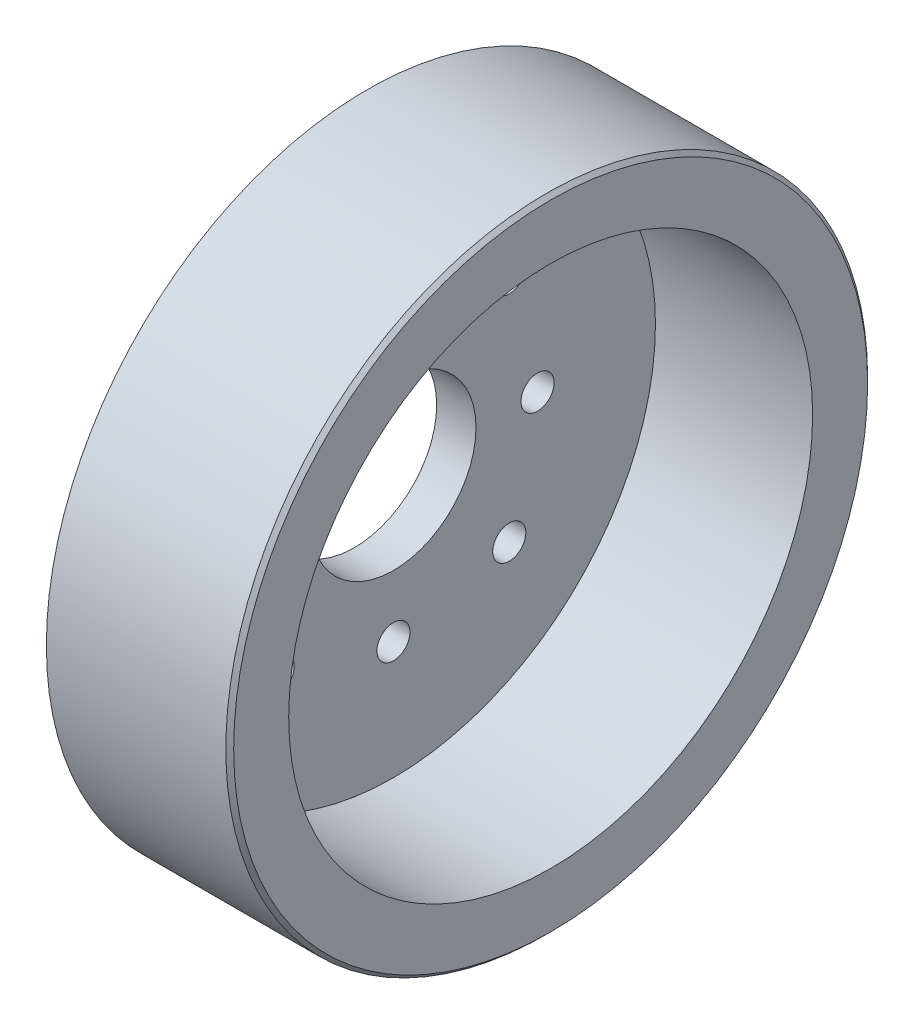
ISO-10303-21;
HEADER;
FILE_DESCRIPTION(('STEP AP214'),'2;1');
FILE_NAME('part.step','',(''),(''),'','','');
FILE_SCHEMA(('AUTOMOTIVE_DESIGN { 1 0 10303 214 1 1 1 1 }'));
ENDSEC;
DATA;
#1=APPLICATION_CONTEXT('core data for automotive mechanical design processes');
#2=APPLICATION_PROTOCOL_DEFINITION('international standard','automotive_design',2000,#1);
#3=PRODUCT_CONTEXT('',#1,'mechanical');
#4=PRODUCT('Part','Part','',(#3));
#5=PRODUCT_RELATED_PRODUCT_CATEGORY('part','',(#4));
#6=PRODUCT_DEFINITION_FORMATION('','',#4);
#7=PRODUCT_DEFINITION_CONTEXT('part definition',#1,'design');
#8=PRODUCT_DEFINITION('design','',#6,#7);
#9=PRODUCT_DEFINITION_SHAPE('','',#8);
#10=(LENGTH_UNIT() NAMED_UNIT(*) SI_UNIT(.MILLI.,.METRE.));
#11=(NAMED_UNIT(*) PLANE_ANGLE_UNIT() SI_UNIT($,.RADIAN.));
#12=(NAMED_UNIT(*) SI_UNIT($,.STERADIAN.) SOLID_ANGLE_UNIT());
#13=UNCERTAINTY_MEASURE_WITH_UNIT(LENGTH_MEASURE(1.E-05),#10,'distance_accuracy_value','');
#14=(GEOMETRIC_REPRESENTATION_CONTEXT(3) GLOBAL_UNCERTAINTY_ASSIGNED_CONTEXT((#13)) GLOBAL_UNIT_ASSIGNED_CONTEXT((#10,
#11,#12)) REPRESENTATION_CONTEXT('',''));
#15=CARTESIAN_POINT('',(0.,0.,0.));
#16=DIRECTION('',(0.,0.,1.));
#17=DIRECTION('',(1.,0.,0.));
#18=AXIS2_PLACEMENT_3D('',#15,#16,#17);
#19=CARTESIAN_POINT('',(14.9999999999993,0.,0.));
#20=DIRECTION('',(1.,0.,0.));
#21=DIRECTION('',(0.,1.,0.));
#22=AXIS2_PLACEMENT_3D('',#19,#20,#21);
#23=PLANE('',#22);
#24=CARTESIAN_POINT('',(14.9999999999993,0.,0.));
#25=DIRECTION('',(-1.,0.,0.));
#26=DIRECTION('',(0.,1.,0.));
#27=AXIS2_PLACEMENT_3D('',#24,#25,#26);
#28=CIRCLE('',#27,20.);
#29=CARTESIAN_POINT('',(14.9999999999993,-20.,0.));
#30=VERTEX_POINT('',#29);
#31=EDGE_CURVE('E295',#30,#30,#28,.T.);
#32=ORIENTED_EDGE('',*,*,#31,.T.);
#33=EDGE_LOOP('',(#32));
#34=FACE_BOUND('',#33,.T.);
#35=CARTESIAN_POINT('',(14.9999999999993,0.,0.));
#36=DIRECTION('',(-1.,0.,0.));
#37=DIRECTION('',(0.,0.,1.));
#38=AXIS2_PLACEMENT_3D('',#35,#36,#37);
#39=CIRCLE('',#38,24.1999999999991);
#40=CARTESIAN_POINT('',(14.9999999999993,0.,-24.1999999999991));
#41=VERTEX_POINT('',#40);
#42=EDGE_CURVE('E198',#41,#41,#39,.T.);
#43=ORIENTED_EDGE('',*,*,#42,.F.);
#44=EDGE_LOOP('',(#43));
#45=FACE_BOUND('',#44,.T.);
#46=ADVANCED_FACE('F17',(#34,#45),#23,.T.);
#47=CARTESIAN_POINT('',(1.65,8.83883476483179,-8.8388347648319));
#48=DIRECTION('',(1.,0.,0.));
#49=DIRECTION('',(0.,-1.,0.));
#50=AXIS2_PLACEMENT_3D('',#47,#48,#49);
#51=CYLINDRICAL_SURFACE('',#50,1.2645);
#52=CARTESIAN_POINT('',(0.,8.83883476483179,-8.8388347648319));
#53=DIRECTION('',(1.,0.,0.));
#54=DIRECTION('',(0.,-1.,0.));
#55=AXIS2_PLACEMENT_3D('',#52,#53,#54);
#56=CIRCLE('',#55,1.2645);
#57=CARTESIAN_POINT('',(0.,10.1033347648318,-8.8388347648319));
#58=VERTEX_POINT('',#57);
#59=EDGE_CURVE('E152',#58,#58,#56,.T.);
#60=ORIENTED_EDGE('',*,*,#59,.F.);
#61=DIRECTION('',(1.,0.,0.));
#62=VECTOR('',#61,1.);
#63=CARTESIAN_POINT('',(1.65,10.1033347648318,-8.8388347648319));
#64=LINE('',#63,#62);
#65=CARTESIAN_POINT('',(3.,10.1033347648318,-8.8388347648319));
#66=VERTEX_POINT('',#65);
#67=EDGE_CURVE('E11',#58,#66,#64,.T.);
#68=ORIENTED_EDGE('',*,*,#67,.T.);
#69=CARTESIAN_POINT('',(3.,8.83883476483179,-8.8388347648319));
#70=DIRECTION('',(1.,0.,0.));
#71=DIRECTION('',(0.,-1.,0.));
#72=AXIS2_PLACEMENT_3D('',#69,#70,#71);
#73=CIRCLE('',#72,1.2645);
#74=EDGE_CURVE('E285',#66,#66,#73,.T.);
#75=ORIENTED_EDGE('',*,*,#74,.T.);
#76=ORIENTED_EDGE('',*,*,#67,.F.);
#77=EDGE_LOOP('',(#60,#68,#75,#76));
#78=FACE_BOUND('',#77,.T.);
#79=ADVANCED_FACE('F19',(#78),#51,.F.);
#80=CARTESIAN_POINT('',(1.65,-8.8388347648319,-8.83883476483179));
#81=DIRECTION('',(1.,0.,0.));
#82=DIRECTION('',(0.,-1.,0.));
#83=AXIS2_PLACEMENT_3D('',#80,#81,#82);
#84=CYLINDRICAL_SURFACE('',#83,1.2645);
#85=CARTESIAN_POINT('',(0.,-8.8388347648319,-8.83883476483179));
#86=DIRECTION('',(1.,0.,0.));
#87=DIRECTION('',(0.,-1.,0.));
#88=AXIS2_PLACEMENT_3D('',#85,#86,#87);
#89=CIRCLE('',#88,1.2645);
#90=CARTESIAN_POINT('',(0.,-7.5743347648319,-8.83883476483179));
#91=VERTEX_POINT('',#90);
#92=EDGE_CURVE('E142',#91,#91,#89,.T.);
#93=ORIENTED_EDGE('',*,*,#92,.F.);
#94=DIRECTION('',(1.,0.,0.));
#95=VECTOR('',#94,1.);
#96=CARTESIAN_POINT('',(1.65,-7.5743347648319,-8.83883476483179));
#97=LINE('',#96,#95);
#98=CARTESIAN_POINT('',(3.,-7.5743347648319,-8.83883476483179));
#99=VERTEX_POINT('',#98);
#100=EDGE_CURVE('E21',#91,#99,#97,.T.);
#101=ORIENTED_EDGE('',*,*,#100,.T.);
#102=CARTESIAN_POINT('',(3.,-8.8388347648319,-8.83883476483179));
#103=DIRECTION('',(1.,0.,0.));
#104=DIRECTION('',(0.,-1.,0.));
#105=AXIS2_PLACEMENT_3D('',#102,#103,#104);
#106=CIRCLE('',#105,1.2645);
#107=EDGE_CURVE('E144',#99,#99,#106,.T.);
#108=ORIENTED_EDGE('',*,*,#107,.T.);
#109=ORIENTED_EDGE('',*,*,#100,.F.);
#110=EDGE_LOOP('',(#93,#101,#108,#109));
#111=FACE_BOUND('',#110,.T.);
#112=ADVANCED_FACE('F141',(#111),#84,.F.);
#113=CARTESIAN_POINT('',(1.65,-8.83883476483179,8.83883476483189));
#114=DIRECTION('',(1.,0.,0.));
#115=DIRECTION('',(0.,-1.,0.));
#116=AXIS2_PLACEMENT_3D('',#113,#114,#115);
#117=CYLINDRICAL_SURFACE('',#116,1.2645);
#118=CARTESIAN_POINT('',(0.,-8.83883476483179,8.83883476483189));
#119=DIRECTION('',(1.,0.,0.));
#120=DIRECTION('',(0.,-1.,0.));
#121=AXIS2_PLACEMENT_3D('',#118,#119,#120);
#122=CIRCLE('',#121,1.2645);
#123=CARTESIAN_POINT('',(0.,-7.57433476483179,8.83883476483189));
#124=VERTEX_POINT('',#123);
#125=EDGE_CURVE('E151',#124,#124,#122,.T.);
#126=ORIENTED_EDGE('',*,*,#125,.F.);
#127=DIRECTION('',(1.,0.,0.));
#128=VECTOR('',#127,1.);
#129=CARTESIAN_POINT('',(1.65,-7.57433476483179,8.83883476483189));
#130=LINE('',#129,#128);
#131=CARTESIAN_POINT('',(3.,-7.57433476483179,8.83883476483189));
#132=VERTEX_POINT('',#131);
#133=EDGE_CURVE('E146',#124,#132,#130,.T.);
#134=ORIENTED_EDGE('',*,*,#133,.T.);
#135=CARTESIAN_POINT('',(3.,-8.83883476483179,8.83883476483189));
#136=DIRECTION('',(1.,0.,0.));
#137=DIRECTION('',(0.,-1.,0.));
#138=AXIS2_PLACEMENT_3D('',#135,#136,#137);
#139=CIRCLE('',#138,1.2645);
#140=EDGE_CURVE('E229',#132,#132,#139,.T.);
#141=ORIENTED_EDGE('',*,*,#140,.T.);
#142=ORIENTED_EDGE('',*,*,#133,.F.);
#143=EDGE_LOOP('',(#126,#134,#141,#142));
#144=FACE_BOUND('',#143,.T.);
#145=ADVANCED_FACE('F227',(#144),#117,.F.);
#146=CARTESIAN_POINT('',(1.65,8.83883476483189,8.83883476483179));
#147=DIRECTION('',(1.,0.,0.));
#148=DIRECTION('',(0.,-1.,0.));
#149=AXIS2_PLACEMENT_3D('',#146,#147,#148);
#150=CYLINDRICAL_SURFACE('',#149,1.2645);
#151=CARTESIAN_POINT('',(0.,8.83883476483189,8.83883476483179));
#152=DIRECTION('',(1.,0.,0.));
#153=DIRECTION('',(0.,-1.,0.));
#154=AXIS2_PLACEMENT_3D('',#151,#152,#153);
#155=CIRCLE('',#154,1.2645);
#156=CARTESIAN_POINT('',(0.,10.1033347648319,8.83883476483179));
#157=VERTEX_POINT('',#156);
#158=EDGE_CURVE('E160',#157,#157,#155,.T.);
#159=ORIENTED_EDGE('',*,*,#158,.F.);
#160=DIRECTION('',(1.,0.,0.));
#161=VECTOR('',#160,1.);
#162=CARTESIAN_POINT('',(1.65,10.1033347648319,8.83883476483179));
#163=LINE('',#162,#161);
#164=CARTESIAN_POINT('',(3.,10.1033347648319,8.83883476483179));
#165=VERTEX_POINT('',#164);
#166=EDGE_CURVE('E219',#157,#165,#163,.T.);
#167=ORIENTED_EDGE('',*,*,#166,.T.);
#168=CARTESIAN_POINT('',(3.,8.83883476483189,8.83883476483179));
#169=DIRECTION('',(1.,0.,0.));
#170=DIRECTION('',(0.,-1.,0.));
#171=AXIS2_PLACEMENT_3D('',#168,#169,#170);
#172=CIRCLE('',#171,1.2645);
#173=EDGE_CURVE('E299',#165,#165,#172,.T.);
#174=ORIENTED_EDGE('',*,*,#173,.T.);
#175=ORIENTED_EDGE('',*,*,#166,.F.);
#176=EDGE_LOOP('',(#159,#167,#174,#175));
#177=FACE_BOUND('',#176,.T.);
#178=ADVANCED_FACE('F264',(#177),#150,.F.);
#179=CARTESIAN_POINT('',(1.65,0.,11.));
#180=DIRECTION('',(1.,0.,0.));
#181=DIRECTION('',(0.,-1.,0.));
#182=AXIS2_PLACEMENT_3D('',#179,#180,#181);
#183=CYLINDRICAL_SURFACE('',#182,1.2645);
#184=CARTESIAN_POINT('',(0.,0.,11.));
#185=DIRECTION('',(1.,0.,0.));
#186=DIRECTION('',(0.,-1.,0.));
#187=AXIS2_PLACEMENT_3D('',#184,#185,#186);
#188=CIRCLE('',#187,1.2645);
#189=CARTESIAN_POINT('',(0.,1.2645,11.));
#190=VERTEX_POINT('',#189);
#191=EDGE_CURVE('E169',#190,#190,#188,.T.);
#192=ORIENTED_EDGE('',*,*,#191,.F.);
#193=DIRECTION('',(1.,0.,0.));
#194=VECTOR('',#193,1.);
#195=CARTESIAN_POINT('',(1.65,1.2645,11.));
#196=LINE('',#195,#194);
#197=CARTESIAN_POINT('',(3.,1.2645,11.));
#198=VERTEX_POINT('',#197);
#199=EDGE_CURVE('E216',#190,#198,#196,.T.);
#200=ORIENTED_EDGE('',*,*,#199,.T.);
#201=CARTESIAN_POINT('',(3.,0.,11.));
#202=DIRECTION('',(1.,0.,0.));
#203=DIRECTION('',(0.,-1.,0.));
#204=AXIS2_PLACEMENT_3D('',#201,#202,#203);
#205=CIRCLE('',#204,1.2645);
#206=EDGE_CURVE('E304',#198,#198,#205,.T.);
#207=ORIENTED_EDGE('',*,*,#206,.T.);
#208=ORIENTED_EDGE('',*,*,#199,.F.);
#209=EDGE_LOOP('',(#192,#200,#207,#208));
#210=FACE_BOUND('',#209,.T.);
#211=ADVANCED_FACE('F262',(#210),#183,.F.);
#212=CARTESIAN_POINT('',(1.65,-11.,0.));
#213=DIRECTION('',(1.,0.,0.));
#214=DIRECTION('',(0.,-1.,0.));
#215=AXIS2_PLACEMENT_3D('',#212,#213,#214);
#216=CYLINDRICAL_SURFACE('',#215,1.2645);
#217=CARTESIAN_POINT('',(0.,-11.,0.));
#218=DIRECTION('',(1.,0.,0.));
#219=DIRECTION('',(0.,-1.,0.));
#220=AXIS2_PLACEMENT_3D('',#217,#218,#219);
#221=CIRCLE('',#220,1.2645);
#222=CARTESIAN_POINT('',(0.,-9.7355,0.));
#223=VERTEX_POINT('',#222);
#224=EDGE_CURVE('E173',#223,#223,#221,.T.);
#225=ORIENTED_EDGE('',*,*,#224,.F.);
#226=DIRECTION('',(1.,0.,0.));
#227=VECTOR('',#226,1.);
#228=CARTESIAN_POINT('',(1.65,-9.7355,0.));
#229=LINE('',#228,#227);
#230=CARTESIAN_POINT('',(3.,-9.7355,0.));
#231=VERTEX_POINT('',#230);
#232=EDGE_CURVE('E213',#223,#231,#229,.T.);
#233=ORIENTED_EDGE('',*,*,#232,.T.);
#234=CARTESIAN_POINT('',(3.,-11.,0.));
#235=DIRECTION('',(1.,0.,0.));
#236=DIRECTION('',(0.,-1.,0.));
#237=AXIS2_PLACEMENT_3D('',#234,#235,#236);
#238=CIRCLE('',#237,1.2645);
#239=EDGE_CURVE('E313',#231,#231,#238,.T.);
#240=ORIENTED_EDGE('',*,*,#239,.T.);
#241=ORIENTED_EDGE('',*,*,#232,.F.);
#242=EDGE_LOOP('',(#225,#233,#240,#241));
#243=FACE_BOUND('',#242,.T.);
#244=ADVANCED_FACE('F272',(#243),#216,.F.);
#245=CARTESIAN_POINT('',(1.65,0.,-11.));
#246=DIRECTION('',(1.,0.,0.));
#247=DIRECTION('',(0.,-1.,0.));
#248=AXIS2_PLACEMENT_3D('',#245,#246,#247);
#249=CYLINDRICAL_SURFACE('',#248,1.2645);
#250=CARTESIAN_POINT('',(0.,0.,-11.));
#251=DIRECTION('',(1.,0.,0.));
#252=DIRECTION('',(0.,-1.,0.));
#253=AXIS2_PLACEMENT_3D('',#250,#251,#252);
#254=CIRCLE('',#253,1.2645);
#255=CARTESIAN_POINT('',(0.,1.2645,-11.));
#256=VERTEX_POINT('',#255);
#257=EDGE_CURVE('E177',#256,#256,#254,.T.);
#258=ORIENTED_EDGE('',*,*,#257,.F.);
#259=DIRECTION('',(1.,0.,0.));
#260=VECTOR('',#259,1.);
#261=CARTESIAN_POINT('',(1.65,1.2645,-11.));
#262=LINE('',#261,#260);
#263=CARTESIAN_POINT('',(3.,1.2645,-11.));
#264=VERTEX_POINT('',#263);
#265=EDGE_CURVE('E212',#256,#264,#262,.T.);
#266=ORIENTED_EDGE('',*,*,#265,.T.);
#267=CARTESIAN_POINT('',(3.,0.,-11.));
#268=DIRECTION('',(1.,0.,0.));
#269=DIRECTION('',(0.,-1.,0.));
#270=AXIS2_PLACEMENT_3D('',#267,#268,#269);
#271=CIRCLE('',#270,1.2645);
#272=EDGE_CURVE('E317',#264,#264,#271,.T.);
#273=ORIENTED_EDGE('',*,*,#272,.T.);
#274=ORIENTED_EDGE('',*,*,#265,.F.);
#275=EDGE_LOOP('',(#258,#266,#273,#274));
#276=FACE_BOUND('',#275,.T.);
#277=ADVANCED_FACE('F538',(#276),#249,.F.);
#278=CARTESIAN_POINT('',(1.65,11.,0.));
#279=DIRECTION('',(1.,0.,0.));
#280=DIRECTION('',(0.,-1.,0.));
#281=AXIS2_PLACEMENT_3D('',#278,#279,#280);
#282=CYLINDRICAL_SURFACE('',#281,1.2645);
#283=CARTESIAN_POINT('',(0.,11.,0.));
#284=DIRECTION('',(1.,0.,0.));
#285=DIRECTION('',(0.,-1.,0.));
#286=AXIS2_PLACEMENT_3D('',#283,#284,#285);
#287=CIRCLE('',#286,1.2645);
#288=CARTESIAN_POINT('',(0.,12.2645,0.));
#289=VERTEX_POINT('',#288);
#290=EDGE_CURVE('E181',#289,#289,#287,.T.);
#291=ORIENTED_EDGE('',*,*,#290,.F.);
#292=DIRECTION('',(1.,0.,0.));
#293=VECTOR('',#292,1.);
#294=CARTESIAN_POINT('',(1.65,12.2645,0.));
#295=LINE('',#294,#293);
#296=CARTESIAN_POINT('',(3.,12.2645,0.));
#297=VERTEX_POINT('',#296);
#298=EDGE_CURVE('E209',#289,#297,#295,.T.);
#299=ORIENTED_EDGE('',*,*,#298,.T.);
#300=CARTESIAN_POINT('',(3.,11.,0.));
#301=DIRECTION('',(1.,0.,0.));
#302=DIRECTION('',(0.,-1.,0.));
#303=AXIS2_PLACEMENT_3D('',#300,#301,#302);
#304=CIRCLE('',#303,1.2645);
#305=EDGE_CURVE('E323',#297,#297,#304,.T.);
#306=ORIENTED_EDGE('',*,*,#305,.T.);
#307=ORIENTED_EDGE('',*,*,#298,.F.);
#308=EDGE_LOOP('',(#291,#299,#306,#307));
#309=FACE_BOUND('',#308,.T.);
#310=ADVANCED_FACE('F529',(#309),#282,.F.);
#311=CARTESIAN_POINT('',(1.,0.,0.));
#312=DIRECTION('',(1.,0.,0.));
#313=DIRECTION('',(0.,0.,-1.));
#314=AXIS2_PLACEMENT_3D('',#311,#312,#313);
#315=CONICAL_SURFACE('',#314,24.4999999999992,1.10714871779407);
#316=CARTESIAN_POINT('',(1.,0.,0.));
#317=DIRECTION('',(-1.,0.,0.));
#318=DIRECTION('',(0.,0.,1.));
#319=AXIS2_PLACEMENT_3D('',#316,#317,#318);
#320=CIRCLE('',#319,24.4999999999992);
#321=CARTESIAN_POINT('',(1.,0.,-24.4999999999992));
#322=VERTEX_POINT('',#321);
#323=CARTESIAN_POINT('',(1.,0.,24.4999999999992));
#324=VERTEX_POINT('',#323);
#325=EDGE_CURVE('E201',#322,#324,#320,.T.);
#326=ORIENTED_EDGE('',*,*,#325,.T.);
#327=DIRECTION('',(-0.447213595499979,0.,-0.894427190999906));
#328=VECTOR('',#327,1.);
#329=CARTESIAN_POINT('',(1.,0.,24.4999999999992));
#330=LINE('',#329,#328);
#331=CARTESIAN_POINT('',(0.,0.,22.4999999999993));
#332=VERTEX_POINT('',#331);
#333=EDGE_CURVE('E39',#324,#332,#330,.T.);
#334=ORIENTED_EDGE('',*,*,#333,.T.);
#335=CARTESIAN_POINT('',(0.,0.,0.));
#336=DIRECTION('',(-1.,0.,0.));
#337=DIRECTION('',(0.,0.,1.));
#338=AXIS2_PLACEMENT_3D('',#335,#336,#337);
#339=CIRCLE('',#338,22.4999999999993);
#340=EDGE_CURVE('E163',#332,#332,#339,.T.);
#341=ORIENTED_EDGE('',*,*,#340,.F.);
#342=ORIENTED_EDGE('',*,*,#333,.F.);
#343=CARTESIAN_POINT('',(1.,0.,0.));
#344=DIRECTION('',(-1.,0.,0.));
#345=DIRECTION('',(0.,0.,1.));
#346=AXIS2_PLACEMENT_3D('',#343,#344,#345);
#347=CIRCLE('',#346,24.4999999999992);
#348=EDGE_CURVE('E45',#324,#322,#347,.T.);
#349=ORIENTED_EDGE('',*,*,#348,.T.);
#350=EDGE_LOOP('',(#326,#334,#341,#342,#349));
#351=FACE_BOUND('',#350,.T.);
#352=ADVANCED_FACE('F519',(#351),#315,.T.);
#353=CARTESIAN_POINT('',(-4.39927313327325,0.,0.));
#354=DIRECTION('',(-1.,0.,0.));
#355=DIRECTION('',(0.,0.,1.));
#356=AXIS2_PLACEMENT_3D('',#353,#354,#355);
#357=CYLINDRICAL_SURFACE('',#356,24.4999999999992);
#358=ORIENTED_EDGE('',*,*,#325,.F.);
#359=DIRECTION('',(1.,0.,0.));
#360=VECTOR('',#359,1.);
#361=CARTESIAN_POINT('',(-4.39927313327325,0.,-24.4999999999992));
#362=LINE('',#361,#360);
#363=CARTESIAN_POINT('',(14.6999999999991,0.,-24.4999999999991));
#364=VERTEX_POINT('',#363);
#365=EDGE_CURVE('E204',#322,#364,#362,.T.);
#366=ORIENTED_EDGE('',*,*,#365,.T.);
#367=CARTESIAN_POINT('',(14.6999999999991,0.,0.));
#368=DIRECTION('',(-1.,0.,0.));
#369=DIRECTION('',(0.,0.,1.));
#370=AXIS2_PLACEMENT_3D('',#367,#368,#369);
#371=CIRCLE('',#370,24.4999999999991);
#372=EDGE_CURVE('E190',#364,#364,#371,.T.);
#373=ORIENTED_EDGE('',*,*,#372,.T.);
#374=ORIENTED_EDGE('',*,*,#365,.F.);
#375=ORIENTED_EDGE('',*,*,#348,.F.);
#376=EDGE_LOOP('',(#358,#366,#373,#374,#375));
#377=FACE_BOUND('',#376,.T.);
#378=ADVANCED_FACE('F508',(#377),#357,.T.);
#379=CARTESIAN_POINT('',(14.9999999999993,0.,0.));
#380=DIRECTION('',(-1.,0.,0.));
#381=DIRECTION('',(0.,0.,1.));
#382=AXIS2_PLACEMENT_3D('',#379,#380,#381);
#383=CONICAL_SURFACE('',#382,24.1999999999991,0.785398163397072);
#384=ORIENTED_EDGE('',*,*,#372,.F.);
#385=DIRECTION('',(0.707106781186813,0.,0.707106781186282));
#386=VECTOR('',#385,1.);
#387=CARTESIAN_POINT('',(14.9999999999993,0.,-24.1999999999991));
#388=LINE('',#387,#386);
#389=EDGE_CURVE('E194',#364,#41,#388,.T.);
#390=ORIENTED_EDGE('',*,*,#389,.T.);
#391=ORIENTED_EDGE('',*,*,#42,.T.);
#392=ORIENTED_EDGE('',*,*,#389,.F.);
#393=EDGE_LOOP('',(#384,#390,#391,#392));
#394=FACE_BOUND('',#393,.T.);
#395=ADVANCED_FACE('F245',(#394),#383,.T.);
#396=CARTESIAN_POINT('',(-4.39927313327325,0.,0.));
#397=DIRECTION('',(-1.,0.,0.));
#398=DIRECTION('',(0.,0.,1.));
#399=AXIS2_PLACEMENT_3D('',#396,#397,#398);
#400=CYLINDRICAL_SURFACE('',#399,6.3);
#401=CARTESIAN_POINT('',(2.99999999999932,0.,0.));
#402=DIRECTION('',(1.,0.,0.));
#403=DIRECTION('',(0.,0.,1.));
#404=AXIS2_PLACEMENT_3D('',#401,#402,#403);
#405=CIRCLE('',#404,6.3);
#406=CARTESIAN_POINT('',(2.99999999999932,0.,-6.3));
#407=VERTEX_POINT('',#406);
#408=EDGE_CURVE('E288',#407,#407,#405,.T.);
#409=ORIENTED_EDGE('',*,*,#408,.T.);
#410=DIRECTION('',(-1.,0.,0.));
#411=VECTOR('',#410,1.);
#412=CARTESIAN_POINT('',(-4.39927313327325,0.,-6.3));
#413=LINE('',#412,#411);
#414=CARTESIAN_POINT('',(0.,0.,-6.3));
#415=VERTEX_POINT('',#414);
#416=EDGE_CURVE('E189',#407,#415,#413,.T.);
#417=ORIENTED_EDGE('',*,*,#416,.T.);
#418=CARTESIAN_POINT('',(0.,0.,0.));
#419=DIRECTION('',(-1.,0.,0.));
#420=DIRECTION('',(0.,0.,1.));
#421=AXIS2_PLACEMENT_3D('',#418,#419,#420);
#422=CIRCLE('',#421,6.3);
#423=EDGE_CURVE('E185',#415,#415,#422,.T.);
#424=ORIENTED_EDGE('',*,*,#423,.T.);
#425=ORIENTED_EDGE('',*,*,#416,.F.);
#426=EDGE_LOOP('',(#409,#417,#424,#425));
#427=FACE_BOUND('',#426,.T.);
#428=ADVANCED_FACE('F233',(#427),#400,.F.);
#429=CARTESIAN_POINT('',(0.,6.3,0.));
#430=DIRECTION('',(1.,0.,0.));
#431=DIRECTION('',(0.,1.,0.));
#432=AXIS2_PLACEMENT_3D('',#429,#430,#431);
#433=PLANE('',#432);
#434=ORIENTED_EDGE('',*,*,#423,.F.);
#435=EDGE_LOOP('',(#434));
#436=FACE_BOUND('',#435,.T.);
#437=ORIENTED_EDGE('',*,*,#290,.T.);
#438=EDGE_LOOP('',(#437));
#439=FACE_BOUND('',#438,.T.);
#440=ORIENTED_EDGE('',*,*,#257,.T.);
#441=EDGE_LOOP('',(#440));
#442=FACE_BOUND('',#441,.T.);
#443=ORIENTED_EDGE('',*,*,#224,.T.);
#444=EDGE_LOOP('',(#443));
#445=FACE_BOUND('',#444,.T.);
#446=ORIENTED_EDGE('',*,*,#191,.T.);
#447=EDGE_LOOP('',(#446));
#448=FACE_BOUND('',#447,.T.);
#449=ORIENTED_EDGE('',*,*,#158,.T.);
#450=EDGE_LOOP('',(#449));
#451=FACE_BOUND('',#450,.T.);
#452=ORIENTED_EDGE('',*,*,#125,.T.);
#453=EDGE_LOOP('',(#452));
#454=FACE_BOUND('',#453,.T.);
#455=ORIENTED_EDGE('',*,*,#92,.T.);
#456=EDGE_LOOP('',(#455));
#457=FACE_BOUND('',#456,.T.);
#458=ORIENTED_EDGE('',*,*,#59,.T.);
#459=EDGE_LOOP('',(#458));
#460=FACE_BOUND('',#459,.T.);
#461=ORIENTED_EDGE('',*,*,#340,.T.);
#462=EDGE_LOOP('',(#461));
#463=FACE_BOUND('',#462,.T.);
#464=ADVANCED_FACE('F148',(#436,#439,#442,#445,#448,#451,#454,#457,#460,#463),#433,.F.);
#465=CARTESIAN_POINT('',(8.99999999999932,0.,0.));
#466=DIRECTION('',(-1.,0.,0.));
#467=DIRECTION('',(0.,1.,0.));
#468=AXIS2_PLACEMENT_3D('',#465,#466,#467);
#469=CYLINDRICAL_SURFACE('',#468,20.);
#470=ORIENTED_EDGE('',*,*,#31,.F.);
#471=DIRECTION('',(-1.,0.,0.));
#472=VECTOR('',#471,1.);
#473=CARTESIAN_POINT('',(8.99999999999932,-20.,0.));
#474=LINE('',#473,#472);
#475=CARTESIAN_POINT('',(2.99999999999932,-20.,0.));
#476=VERTEX_POINT('',#475);
#477=EDGE_CURVE('E166',#30,#476,#474,.T.);
#478=ORIENTED_EDGE('',*,*,#477,.T.);
#479=CARTESIAN_POINT('',(2.99999999999932,0.,0.));
#480=DIRECTION('',(-1.,0.,0.));
#481=DIRECTION('',(0.,1.,0.));
#482=AXIS2_PLACEMENT_3D('',#479,#480,#481);
#483=CIRCLE('',#482,20.);
#484=EDGE_CURVE('E331',#476,#476,#483,.T.);
#485=ORIENTED_EDGE('',*,*,#484,.T.);
#486=ORIENTED_EDGE('',*,*,#477,.F.);
#487=EDGE_LOOP('',(#470,#478,#485,#486));
#488=FACE_BOUND('',#487,.T.);
#489=ADVANCED_FACE('F232',(#488),#469,.F.);
#490=CARTESIAN_POINT('',(2.99999999999932,0.,0.));
#491=DIRECTION('',(-1.,0.,0.));
#492=DIRECTION('',(0.,1.,0.));
#493=AXIS2_PLACEMENT_3D('',#490,#491,#492);
#494=PLANE('',#493);
#495=ORIENTED_EDGE('',*,*,#408,.F.);
#496=EDGE_LOOP('',(#495));
#497=FACE_BOUND('',#496,.T.);
#498=ORIENTED_EDGE('',*,*,#74,.F.);
#499=EDGE_LOOP('',(#498));
#500=FACE_BOUND('',#499,.T.);
#501=ORIENTED_EDGE('',*,*,#107,.F.);
#502=EDGE_LOOP('',(#501));
#503=FACE_BOUND('',#502,.T.);
#504=ORIENTED_EDGE('',*,*,#140,.F.);
#505=EDGE_LOOP('',(#504));
#506=FACE_BOUND('',#505,.T.);
#507=ORIENTED_EDGE('',*,*,#173,.F.);
#508=EDGE_LOOP('',(#507));
#509=FACE_BOUND('',#508,.T.);
#510=ORIENTED_EDGE('',*,*,#206,.F.);
#511=EDGE_LOOP('',(#510));
#512=FACE_BOUND('',#511,.T.);
#513=ORIENTED_EDGE('',*,*,#239,.F.);
#514=EDGE_LOOP('',(#513));
#515=FACE_BOUND('',#514,.T.);
#516=ORIENTED_EDGE('',*,*,#272,.F.);
#517=EDGE_LOOP('',(#516));
#518=FACE_BOUND('',#517,.T.);
#519=ORIENTED_EDGE('',*,*,#305,.F.);
#520=EDGE_LOOP('',(#519));
#521=FACE_BOUND('',#520,.T.);
#522=ORIENTED_EDGE('',*,*,#484,.F.);
#523=EDGE_LOOP('',(#522));
#524=FACE_BOUND('',#523,.T.);
#525=ADVANCED_FACE('F242',(#497,#500,#503,#506,#509,#512,#515,#518,#521,#524),#494,.F.);
#526=CLOSED_SHELL('',(#46,#79,#112,#145,#178,#211,#244,#277,#310,#352,#378,#395,#428,#464,#489,#525));
#527=MANIFOLD_SOLID_BREP('B1',#526);
#528=ADVANCED_BREP_SHAPE_REPRESENTATION('',(#18,#527),#14);
#529=SHAPE_DEFINITION_REPRESENTATION(#9,#528);
ENDSEC;
END-ISO-10303-21;
